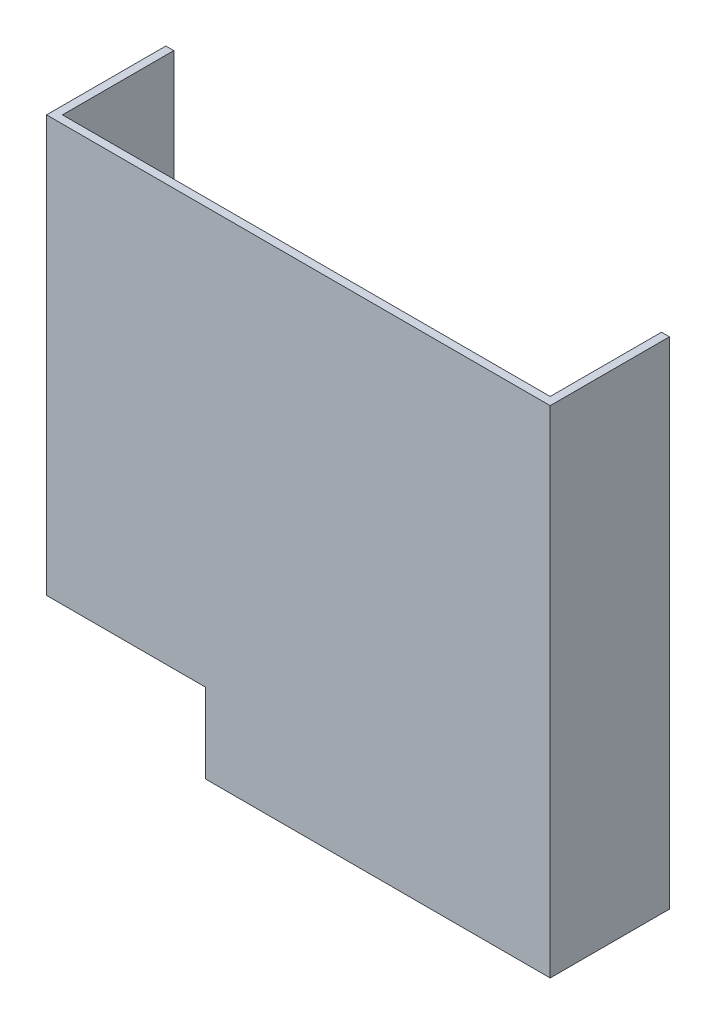
ISO-10303-21;
HEADER;
FILE_DESCRIPTION(('STEP AP214'),'2;1');
FILE_NAME('part.step','',(''),(''),'','','');
FILE_SCHEMA(('AUTOMOTIVE_DESIGN { 1 0 10303 214 1 1 1 1 }'));
ENDSEC;
DATA;
#1=APPLICATION_CONTEXT('core data for automotive mechanical design processes');
#2=APPLICATION_PROTOCOL_DEFINITION('international standard','automotive_design',2000,#1);
#3=PRODUCT_CONTEXT('',#1,'mechanical');
#4=PRODUCT('Part','Part','',(#3));
#5=PRODUCT_RELATED_PRODUCT_CATEGORY('part','',(#4));
#6=PRODUCT_DEFINITION_FORMATION('','',#4);
#7=PRODUCT_DEFINITION_CONTEXT('part definition',#1,'design');
#8=PRODUCT_DEFINITION('design','',#6,#7);
#9=PRODUCT_DEFINITION_SHAPE('','',#8);
#10=(LENGTH_UNIT() NAMED_UNIT(*) SI_UNIT(.MILLI.,.METRE.));
#11=(NAMED_UNIT(*) PLANE_ANGLE_UNIT() SI_UNIT($,.RADIAN.));
#12=(NAMED_UNIT(*) SI_UNIT($,.STERADIAN.) SOLID_ANGLE_UNIT());
#13=UNCERTAINTY_MEASURE_WITH_UNIT(LENGTH_MEASURE(1.E-05),#10,'distance_accuracy_value','');
#14=(GEOMETRIC_REPRESENTATION_CONTEXT(3) GLOBAL_UNCERTAINTY_ASSIGNED_CONTEXT((#13)) GLOBAL_UNIT_ASSIGNED_CONTEXT((#10,
#11,#12)) REPRESENTATION_CONTEXT('',''));
#15=CARTESIAN_POINT('',(0.,0.,0.));
#16=DIRECTION('',(0.,0.,1.));
#17=DIRECTION('',(1.,0.,0.));
#18=AXIS2_PLACEMENT_3D('',#15,#16,#17);
#19=CARTESIAN_POINT('',(-38.0674441624365,29.1519796954315,-45.));
#20=DIRECTION('',(-1.,0.,0.));
#21=DIRECTION('',(0.,-1.,0.));
#22=AXIS2_PLACEMENT_3D('',#19,#20,#21);
#23=PLANE('',#22);
#24=DIRECTION('',(0.,-1.,0.));
#25=VECTOR('',#24,1.);
#26=CARTESIAN_POINT('',(-38.0674441624365,29.1519796954315,0.));
#27=LINE('',#26,#25);
#28=CARTESIAN_POINT('',(-38.0674441624365,26.1519796954315,0.));
#29=VERTEX_POINT('',#28);
#30=CARTESIAN_POINT('',(-38.0674441624365,-130.848020304569,0.));
#31=VERTEX_POINT('',#30);
#32=EDGE_CURVE('E147',#29,#31,#27,.T.);
#33=ORIENTED_EDGE('',*,*,#32,.F.);
#34=DIRECTION('',(0.,0.,1.));
#35=VECTOR('',#34,1.);
#36=CARTESIAN_POINT('',(-38.0674441624365,26.1519796954315,0.));
#37=LINE('',#36,#35);
#38=CARTESIAN_POINT('',(-38.0674441624365,26.1519796954315,-45.));
#39=VERTEX_POINT('',#38);
#40=EDGE_CURVE('E134',#39,#29,#37,.T.);
#41=ORIENTED_EDGE('',*,*,#40,.F.);
#42=DIRECTION('',(0.,-1.,0.));
#43=VECTOR('',#42,1.);
#44=CARTESIAN_POINT('',(-38.0674441624365,29.1519796954315,-45.));
#45=LINE('',#44,#43);
#46=CARTESIAN_POINT('',(-38.0674441624365,-130.848020304569,-45.));
#47=VERTEX_POINT('',#46);
#48=EDGE_CURVE('E143',#39,#47,#45,.T.);
#49=ORIENTED_EDGE('',*,*,#48,.T.);
#50=DIRECTION('',(0.,0.,1.));
#51=VECTOR('',#50,1.);
#52=CARTESIAN_POINT('',(-38.0674441624365,-130.848020304569,-45.));
#53=LINE('',#52,#51);
#54=EDGE_CURVE('E194',#47,#31,#53,.T.);
#55=ORIENTED_EDGE('',*,*,#54,.T.);
#56=EDGE_LOOP('',(#33,#41,#49,#55));
#57=FACE_BOUND('',#56,.T.);
#58=ADVANCED_FACE('F33',(#57),#23,.T.);
#59=CARTESIAN_POINT('',(151.932555837563,29.1519796954315,-45.));
#60=DIRECTION('',(1.,0.,0.));
#61=DIRECTION('',(0.,1.,0.));
#62=AXIS2_PLACEMENT_3D('',#59,#60,#61);
#63=PLANE('',#62);
#64=DIRECTION('',(0.,1.,0.));
#65=VECTOR('',#64,1.);
#66=CARTESIAN_POINT('',(151.932555837563,29.1519796954315,-45.));
#67=LINE('',#66,#65);
#68=CARTESIAN_POINT('',(151.932555837564,-160.848020304569,-45.));
#69=VERTEX_POINT('',#68);
#70=CARTESIAN_POINT('',(151.932555837563,26.1519796954315,-45.));
#71=VERTEX_POINT('',#70);
#72=EDGE_CURVE('E132',#69,#71,#67,.T.);
#73=ORIENTED_EDGE('',*,*,#72,.T.);
#74=DIRECTION('',(0.,0.,-1.));
#75=VECTOR('',#74,1.);
#76=CARTESIAN_POINT('',(151.932555837563,26.1519796954315,0.));
#77=LINE('',#76,#75);
#78=CARTESIAN_POINT('',(151.932555837563,26.1519796954315,0.));
#79=VERTEX_POINT('',#78);
#80=EDGE_CURVE('E116',#79,#71,#77,.T.);
#81=ORIENTED_EDGE('',*,*,#80,.F.);
#82=DIRECTION('',(0.,1.,0.));
#83=VECTOR('',#82,1.);
#84=CARTESIAN_POINT('',(151.932555837563,29.1519796954315,0.));
#85=LINE('',#84,#83);
#86=CARTESIAN_POINT('',(151.932555837564,-160.848020304569,0.));
#87=VERTEX_POINT('',#86);
#88=EDGE_CURVE('E152',#87,#79,#85,.T.);
#89=ORIENTED_EDGE('',*,*,#88,.F.);
#90=DIRECTION('',(0.,0.,1.));
#91=VECTOR('',#90,1.);
#92=CARTESIAN_POINT('',(151.932555837564,-160.848020304569,-45.));
#93=LINE('',#92,#91);
#94=EDGE_CURVE('E139',#69,#87,#93,.T.);
#95=ORIENTED_EDGE('',*,*,#94,.F.);
#96=EDGE_LOOP('',(#73,#81,#89,#95));
#97=FACE_BOUND('',#96,.T.);
#98=ADVANCED_FACE('F137',(#97),#63,.T.);
#99=CARTESIAN_POINT('',(0.,0.,-45.));
#100=DIRECTION('',(0.,0.,1.));
#101=DIRECTION('',(1.,0.,0.));
#102=AXIS2_PLACEMENT_3D('',#99,#100,#101);
#103=PLANE('',#102);
#104=DIRECTION('',(-1.,0.,0.));
#105=VECTOR('',#104,1.);
#106=CARTESIAN_POINT('',(151.932555837563,26.1519796954315,-45.));
#107=LINE('',#106,#105);
#108=CARTESIAN_POINT('',(148.932555837563,26.1519796954315,-45.));
#109=VERTEX_POINT('',#108);
#110=EDGE_CURVE('E119',#71,#109,#107,.T.);
#111=ORIENTED_EDGE('',*,*,#110,.F.);
#112=ORIENTED_EDGE('',*,*,#72,.F.);
#113=DIRECTION('',(1.,0.,0.));
#114=VECTOR('',#113,1.);
#115=CARTESIAN_POINT('',(-38.0674441624365,-160.848020304569,-45.));
#116=LINE('',#115,#114);
#117=CARTESIAN_POINT('',(21.9325558375635,-160.848020304569,-45.));
#118=VERTEX_POINT('',#117);
#119=EDGE_CURVE('E140',#118,#69,#116,.T.);
#120=ORIENTED_EDGE('',*,*,#119,.F.);
#121=DIRECTION('',(0.,1.,0.));
#122=VECTOR('',#121,1.);
#123=CARTESIAN_POINT('',(21.9325558375635,-130.848020304569,-45.));
#124=LINE('',#123,#122);
#125=CARTESIAN_POINT('',(21.9325558375635,-157.848020304569,-45.));
#126=VERTEX_POINT('',#125);
#127=EDGE_CURVE('E207',#118,#126,#124,.T.);
#128=ORIENTED_EDGE('',*,*,#127,.T.);
#129=DIRECTION('',(1.,0.,0.));
#130=VECTOR('',#129,1.);
#131=CARTESIAN_POINT('',(0.,-157.848020304569,-45.));
#132=LINE('',#131,#130);
#133=CARTESIAN_POINT('',(148.932555837564,-157.848020304569,-45.));
#134=VERTEX_POINT('',#133);
#135=EDGE_CURVE('E55',#126,#134,#132,.T.);
#136=ORIENTED_EDGE('',*,*,#135,.T.);
#137=DIRECTION('',(0.,1.,0.));
#138=VECTOR('',#137,1.);
#139=CARTESIAN_POINT('',(148.932555837563,0.,-45.));
#140=LINE('',#139,#138);
#141=EDGE_CURVE('E133',#134,#109,#140,.T.);
#142=ORIENTED_EDGE('',*,*,#141,.T.);
#143=EDGE_LOOP('',(#111,#112,#120,#128,#136,#142));
#144=FACE_BOUND('',#143,.T.);
#145=ADVANCED_FACE('F130',(#144),#103,.F.);
#146=CARTESIAN_POINT('',(-35.0674441624365,26.1519796954315,-45.));
#147=VERTEX_POINT('',#146);
#148=EDGE_CURVE('E127',#147,#39,#107,.T.);
#149=ORIENTED_EDGE('',*,*,#148,.F.);
#150=DIRECTION('',(0.,-1.,0.));
#151=VECTOR('',#150,1.);
#152=CARTESIAN_POINT('',(-35.0674441624365,0.,-45.));
#153=LINE('',#152,#151);
#154=CARTESIAN_POINT('',(-35.0674441624365,-130.848020304569,-45.));
#155=VERTEX_POINT('',#154);
#156=EDGE_CURVE('E179',#147,#155,#153,.T.);
#157=ORIENTED_EDGE('',*,*,#156,.T.);
#158=DIRECTION('',(-1.,0.,0.));
#159=VECTOR('',#158,1.);
#160=CARTESIAN_POINT('',(21.9325558375635,-130.848020304569,-45.));
#161=LINE('',#160,#159);
#162=EDGE_CURVE('E200',#155,#47,#161,.T.);
#163=ORIENTED_EDGE('',*,*,#162,.T.);
#164=ORIENTED_EDGE('',*,*,#48,.F.);
#165=EDGE_LOOP('',(#149,#157,#163,#164));
#166=FACE_BOUND('',#165,.T.);
#167=ADVANCED_FACE('F206',(#166),#103,.F.);
#168=CARTESIAN_POINT('',(0.,0.,0.));
#169=DIRECTION('',(0.,0.,1.));
#170=DIRECTION('',(1.,0.,0.));
#171=AXIS2_PLACEMENT_3D('',#168,#169,#170);
#172=PLANE('',#171);
#173=ORIENTED_EDGE('',*,*,#88,.T.);
#174=DIRECTION('',(1.,0.,0.));
#175=VECTOR('',#174,1.);
#176=CARTESIAN_POINT('',(151.932555837563,26.1519796954315,0.));
#177=LINE('',#176,#175);
#178=EDGE_CURVE('E122',#29,#79,#177,.T.);
#179=ORIENTED_EDGE('',*,*,#178,.F.);
#180=ORIENTED_EDGE('',*,*,#32,.T.);
#181=DIRECTION('',(-1.,0.,0.));
#182=VECTOR('',#181,1.);
#183=CARTESIAN_POINT('',(21.9325558375635,-130.848020304569,0.));
#184=LINE('',#183,#182);
#185=CARTESIAN_POINT('',(21.9325558375635,-130.848020304569,0.));
#186=VERTEX_POINT('',#185);
#187=EDGE_CURVE('E202',#186,#31,#184,.T.);
#188=ORIENTED_EDGE('',*,*,#187,.F.);
#189=DIRECTION('',(0.,1.,0.));
#190=VECTOR('',#189,1.);
#191=CARTESIAN_POINT('',(21.9325558375635,-130.848020304569,0.));
#192=LINE('',#191,#190);
#193=CARTESIAN_POINT('',(21.9325558375635,-160.848020304569,0.));
#194=VERTEX_POINT('',#193);
#195=EDGE_CURVE('E213',#194,#186,#192,.T.);
#196=ORIENTED_EDGE('',*,*,#195,.F.);
#197=DIRECTION('',(1.,0.,0.));
#198=VECTOR('',#197,1.);
#199=CARTESIAN_POINT('',(-38.0674441624365,-160.848020304569,0.));
#200=LINE('',#199,#198);
#201=EDGE_CURVE('E149',#194,#87,#200,.T.);
#202=ORIENTED_EDGE('',*,*,#201,.T.);
#203=EDGE_LOOP('',(#173,#179,#180,#188,#196,#202));
#204=FACE_BOUND('',#203,.T.);
#205=ADVANCED_FACE('F224',(#204),#172,.T.);
#206=CARTESIAN_POINT('',(-38.0674441624365,-160.848020304569,-45.));
#207=DIRECTION('',(0.,-1.,0.));
#208=DIRECTION('',(0.,0.,-1.));
#209=AXIS2_PLACEMENT_3D('',#206,#207,#208);
#210=PLANE('',#209);
#211=DIRECTION('',(0.,0.,1.));
#212=VECTOR('',#211,1.);
#213=CARTESIAN_POINT('',(21.9325558375635,-160.848020304569,-45.));
#214=LINE('',#213,#212);
#215=EDGE_CURVE('E203',#118,#194,#214,.T.);
#216=ORIENTED_EDGE('',*,*,#215,.F.);
#217=ORIENTED_EDGE('',*,*,#119,.T.);
#218=ORIENTED_EDGE('',*,*,#94,.T.);
#219=ORIENTED_EDGE('',*,*,#201,.F.);
#220=EDGE_LOOP('',(#216,#217,#218,#219));
#221=FACE_BOUND('',#220,.T.);
#222=ADVANCED_FACE('F225',(#221),#210,.T.);
#223=CARTESIAN_POINT('',(-35.0674441624365,29.1519796954315,-45.));
#224=DIRECTION('',(-1.,0.,0.));
#225=DIRECTION('',(0.,-1.,0.));
#226=AXIS2_PLACEMENT_3D('',#223,#224,#225);
#227=PLANE('',#226);
#228=DIRECTION('',(0.,-1.,0.));
#229=VECTOR('',#228,1.);
#230=CARTESIAN_POINT('',(-35.0674441624365,0.,-3.));
#231=LINE('',#230,#229);
#232=CARTESIAN_POINT('',(-35.0674441624365,26.1519796954315,-3.));
#233=VERTEX_POINT('',#232);
#234=CARTESIAN_POINT('',(-35.0674441624365,-130.848020304569,-3.));
#235=VERTEX_POINT('',#234);
#236=EDGE_CURVE('E159',#233,#235,#231,.T.);
#237=ORIENTED_EDGE('',*,*,#236,.T.);
#238=DIRECTION('',(0.,0.,-1.));
#239=VECTOR('',#238,1.);
#240=CARTESIAN_POINT('',(-35.0674441624365,-130.848020304568,-45.));
#241=LINE('',#240,#239);
#242=EDGE_CURVE('E47',#235,#155,#241,.T.);
#243=ORIENTED_EDGE('',*,*,#242,.T.);
#244=ORIENTED_EDGE('',*,*,#156,.F.);
#245=DIRECTION('',(0.,0.,1.));
#246=VECTOR('',#245,1.);
#247=CARTESIAN_POINT('',(-35.0674441624365,26.1519796954315,-45.));
#248=LINE('',#247,#246);
#249=EDGE_CURVE('E150',#147,#233,#248,.T.);
#250=ORIENTED_EDGE('',*,*,#249,.T.);
#251=EDGE_LOOP('',(#237,#243,#244,#250));
#252=FACE_BOUND('',#251,.T.);
#253=ADVANCED_FACE('F163',(#252),#227,.F.);
#254=CARTESIAN_POINT('',(148.932555837563,29.1519796954315,-45.));
#255=DIRECTION('',(1.,0.,0.));
#256=DIRECTION('',(0.,1.,0.));
#257=AXIS2_PLACEMENT_3D('',#254,#255,#256);
#258=PLANE('',#257);
#259=DIRECTION('',(0.,1.,0.));
#260=VECTOR('',#259,1.);
#261=CARTESIAN_POINT('',(148.932555837563,0.,-3.));
#262=LINE('',#261,#260);
#263=CARTESIAN_POINT('',(148.932555837564,-157.848020304569,-3.));
#264=VERTEX_POINT('',#263);
#265=CARTESIAN_POINT('',(148.932555837563,26.1519796954315,-3.));
#266=VERTEX_POINT('',#265);
#267=EDGE_CURVE('E169',#264,#266,#262,.T.);
#268=ORIENTED_EDGE('',*,*,#267,.T.);
#269=DIRECTION('',(0.,0.,1.));
#270=VECTOR('',#269,1.);
#271=CARTESIAN_POINT('',(148.932555837563,26.1519796954315,-45.));
#272=LINE('',#271,#270);
#273=EDGE_CURVE('E176',#109,#266,#272,.T.);
#274=ORIENTED_EDGE('',*,*,#273,.F.);
#275=ORIENTED_EDGE('',*,*,#141,.F.);
#276=DIRECTION('',(0.,0.,1.));
#277=VECTOR('',#276,1.);
#278=CARTESIAN_POINT('',(148.932555837564,-157.848020304569,-45.));
#279=LINE('',#278,#277);
#280=EDGE_CURVE('E181',#134,#264,#279,.T.);
#281=ORIENTED_EDGE('',*,*,#280,.T.);
#282=EDGE_LOOP('',(#268,#274,#275,#281));
#283=FACE_BOUND('',#282,.T.);
#284=ADVANCED_FACE('F229',(#283),#258,.F.);
#285=CARTESIAN_POINT('',(-38.0674441624365,-157.848020304569,-45.));
#286=DIRECTION('',(0.,-1.,0.));
#287=DIRECTION('',(0.,0.,-1.));
#288=AXIS2_PLACEMENT_3D('',#285,#286,#287);
#289=PLANE('',#288);
#290=ORIENTED_EDGE('',*,*,#135,.F.);
#291=DIRECTION('',(0.,0.,1.));
#292=VECTOR('',#291,1.);
#293=CARTESIAN_POINT('',(21.9325558375635,-157.848020304569,-45.));
#294=LINE('',#293,#292);
#295=CARTESIAN_POINT('',(21.9325558375635,-157.848020304569,-3.));
#296=VERTEX_POINT('',#295);
#297=EDGE_CURVE('E167',#126,#296,#294,.T.);
#298=ORIENTED_EDGE('',*,*,#297,.T.);
#299=DIRECTION('',(1.,0.,0.));
#300=VECTOR('',#299,1.);
#301=CARTESIAN_POINT('',(0.,-157.848020304569,-3.));
#302=LINE('',#301,#300);
#303=EDGE_CURVE('E166',#296,#264,#302,.T.);
#304=ORIENTED_EDGE('',*,*,#303,.T.);
#305=ORIENTED_EDGE('',*,*,#280,.F.);
#306=EDGE_LOOP('',(#290,#298,#304,#305));
#307=FACE_BOUND('',#306,.T.);
#308=ADVANCED_FACE('F232',(#307),#289,.F.);
#309=CARTESIAN_POINT('',(0.,0.,-3.));
#310=DIRECTION('',(0.,0.,1.));
#311=DIRECTION('',(1.,0.,0.));
#312=AXIS2_PLACEMENT_3D('',#309,#310,#311);
#313=PLANE('',#312);
#314=ORIENTED_EDGE('',*,*,#303,.F.);
#315=DIRECTION('',(0.,1.,0.));
#316=VECTOR('',#315,1.);
#317=CARTESIAN_POINT('',(21.9325558375635,0.,-3.));
#318=LINE('',#317,#316);
#319=CARTESIAN_POINT('',(21.9325558375635,-130.848020304569,-3.00000000000002));
#320=VERTEX_POINT('',#319);
#321=EDGE_CURVE('E11',#296,#320,#318,.T.);
#322=ORIENTED_EDGE('',*,*,#321,.T.);
#323=DIRECTION('',(-1.,0.,0.));
#324=VECTOR('',#323,1.);
#325=CARTESIAN_POINT('',(0.,-130.848020304569,-3.));
#326=LINE('',#325,#324);
#327=EDGE_CURVE('E40',#320,#235,#326,.T.);
#328=ORIENTED_EDGE('',*,*,#327,.T.);
#329=ORIENTED_EDGE('',*,*,#236,.F.);
#330=DIRECTION('',(-1.,0.,0.));
#331=VECTOR('',#330,1.);
#332=CARTESIAN_POINT('',(0.,26.1519796954315,-3.));
#333=LINE('',#332,#331);
#334=EDGE_CURVE('E177',#266,#233,#333,.T.);
#335=ORIENTED_EDGE('',*,*,#334,.F.);
#336=ORIENTED_EDGE('',*,*,#267,.F.);
#337=EDGE_LOOP('',(#314,#322,#328,#329,#335,#336));
#338=FACE_BOUND('',#337,.T.);
#339=ADVANCED_FACE('F157',(#338),#313,.F.);
#340=CARTESIAN_POINT('',(21.9325558375635,-130.848020304569,-45.));
#341=DIRECTION('',(1.,0.,0.));
#342=DIRECTION('',(0.,0.,-1.));
#343=AXIS2_PLACEMENT_3D('',#340,#341,#342);
#344=PLANE('',#343);
#345=ORIENTED_EDGE('',*,*,#127,.F.);
#346=ORIENTED_EDGE('',*,*,#215,.T.);
#347=ORIENTED_EDGE('',*,*,#195,.T.);
#348=DIRECTION('',(0.,0.,1.));
#349=VECTOR('',#348,1.);
#350=CARTESIAN_POINT('',(21.9325558375635,-130.848020304569,-45.));
#351=LINE('',#350,#349);
#352=EDGE_CURVE('E204',#320,#186,#351,.T.);
#353=ORIENTED_EDGE('',*,*,#352,.F.);
#354=ORIENTED_EDGE('',*,*,#321,.F.);
#355=ORIENTED_EDGE('',*,*,#297,.F.);
#356=EDGE_LOOP('',(#345,#346,#347,#353,#354,#355));
#357=FACE_BOUND('',#356,.T.);
#358=ADVANCED_FACE('F220',(#357),#344,.F.);
#359=CARTESIAN_POINT('',(21.9325558375635,-130.848020304569,-45.));
#360=DIRECTION('',(0.,1.,0.));
#361=DIRECTION('',(0.,0.,1.));
#362=AXIS2_PLACEMENT_3D('',#359,#360,#361);
#363=PLANE('',#362);
#364=ORIENTED_EDGE('',*,*,#327,.F.);
#365=ORIENTED_EDGE('',*,*,#352,.T.);
#366=ORIENTED_EDGE('',*,*,#187,.T.);
#367=ORIENTED_EDGE('',*,*,#54,.F.);
#368=ORIENTED_EDGE('',*,*,#162,.F.);
#369=ORIENTED_EDGE('',*,*,#242,.F.);
#370=EDGE_LOOP('',(#364,#365,#366,#367,#368,#369));
#371=FACE_BOUND('',#370,.T.);
#372=ADVANCED_FACE('F199',(#371),#363,.F.);
#373=CARTESIAN_POINT('',(0.,26.1519796954315,0.));
#374=DIRECTION('',(0.,1.,0.));
#375=DIRECTION('',(0.,0.,1.));
#376=AXIS2_PLACEMENT_3D('',#373,#374,#375);
#377=PLANE('',#376);
#378=ORIENTED_EDGE('',*,*,#249,.F.);
#379=ORIENTED_EDGE('',*,*,#148,.T.);
#380=ORIENTED_EDGE('',*,*,#40,.T.);
#381=ORIENTED_EDGE('',*,*,#178,.T.);
#382=ORIENTED_EDGE('',*,*,#80,.T.);
#383=ORIENTED_EDGE('',*,*,#110,.T.);
#384=ORIENTED_EDGE('',*,*,#273,.T.);
#385=ORIENTED_EDGE('',*,*,#334,.T.);
#386=EDGE_LOOP('',(#378,#379,#380,#381,#382,#383,#384,#385));
#387=FACE_BOUND('',#386,.T.);
#388=ADVANCED_FACE('F118',(#387),#377,.T.);
#389=CLOSED_SHELL('',(#58,#98,#145,#167,#205,#222,#253,#284,#308,#339,#358,#372,#388));
#390=MANIFOLD_SOLID_BREP('B2',#389);
#391=ADVANCED_BREP_SHAPE_REPRESENTATION('',(#18,#390),#14);
#392=SHAPE_DEFINITION_REPRESENTATION(#9,#391);
ENDSEC;
END-ISO-10303-21;
